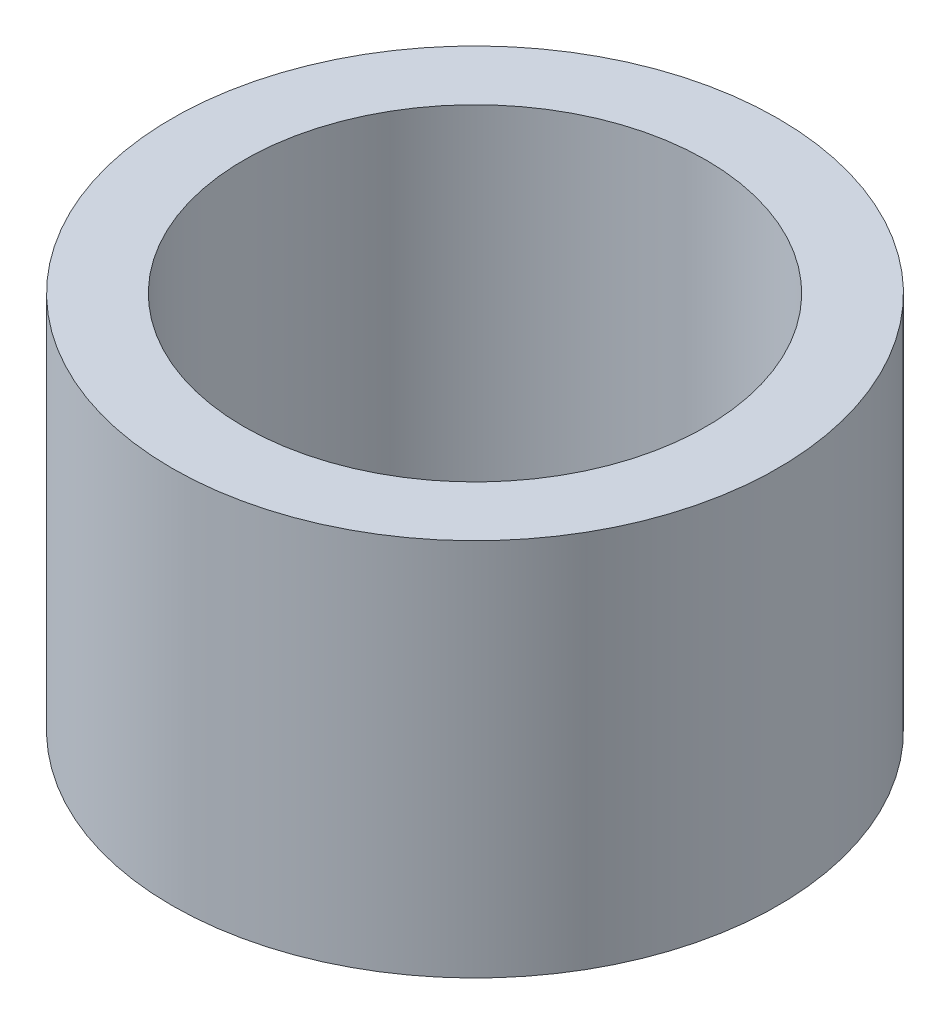
ISO-10303-21;
HEADER;
FILE_DESCRIPTION(('STEP AP214'),'2;1');
FILE_NAME('part.step','',(''),(''),'','','');
FILE_SCHEMA(('AUTOMOTIVE_DESIGN { 1 0 10303 214 1 1 1 1 }'));
ENDSEC;
DATA;
#1=APPLICATION_CONTEXT('core data for automotive mechanical design processes');
#2=APPLICATION_PROTOCOL_DEFINITION('international standard','automotive_design',2000,#1);
#3=PRODUCT_CONTEXT('',#1,'mechanical');
#4=PRODUCT('Part','Part','',(#3));
#5=PRODUCT_RELATED_PRODUCT_CATEGORY('part','',(#4));
#6=PRODUCT_DEFINITION_FORMATION('','',#4);
#7=PRODUCT_DEFINITION_CONTEXT('part definition',#1,'design');
#8=PRODUCT_DEFINITION('design','',#6,#7);
#9=PRODUCT_DEFINITION_SHAPE('','',#8);
#10=(LENGTH_UNIT() NAMED_UNIT(*) SI_UNIT(.MILLI.,.METRE.));
#11=(NAMED_UNIT(*) PLANE_ANGLE_UNIT() SI_UNIT($,.RADIAN.));
#12=(NAMED_UNIT(*) SI_UNIT($,.STERADIAN.) SOLID_ANGLE_UNIT());
#13=UNCERTAINTY_MEASURE_WITH_UNIT(LENGTH_MEASURE(1.E-05),#10,'distance_accuracy_value','');
#14=(GEOMETRIC_REPRESENTATION_CONTEXT(3) GLOBAL_UNCERTAINTY_ASSIGNED_CONTEXT((#13)) GLOBAL_UNIT_ASSIGNED_CONTEXT((#10,
#11,#12)) REPRESENTATION_CONTEXT('',''));
#15=CARTESIAN_POINT('',(0.,0.,0.));
#16=DIRECTION('',(0.,0.,1.));
#17=DIRECTION('',(1.,0.,0.));
#18=AXIS2_PLACEMENT_3D('',#15,#16,#17);
#19=CARTESIAN_POINT('',(0.,5.,0.));
#20=DIRECTION('',(0.,1.,0.));
#21=DIRECTION('',(0.,0.,1.));
#22=AXIS2_PLACEMENT_3D('',#19,#20,#21);
#23=PLANE('',#22);
#24=CARTESIAN_POINT('',(0.,5.,0.));
#25=DIRECTION('',(0.,1.,0.));
#26=DIRECTION('',(0.,0.,1.));
#27=AXIS2_PLACEMENT_3D('',#24,#25,#26);
#28=CIRCLE('',#27,4.);
#29=CARTESIAN_POINT('',(0.,5.,4.));
#30=VERTEX_POINT('',#29);
#31=EDGE_CURVE('E10',#30,#30,#28,.T.);
#32=ORIENTED_EDGE('',*,*,#31,.T.);
#33=EDGE_LOOP('',(#32));
#34=FACE_BOUND('',#33,.T.);
#35=CARTESIAN_POINT('',(0.,5.,0.));
#36=DIRECTION('',(0.,1.,0.));
#37=DIRECTION('',(0.,0.,1.));
#38=AXIS2_PLACEMENT_3D('',#35,#36,#37);
#39=CIRCLE('',#38,3.05);
#40=CARTESIAN_POINT('',(0.,5.,3.05));
#41=VERTEX_POINT('',#40);
#42=EDGE_CURVE('E42',#41,#41,#39,.T.);
#43=ORIENTED_EDGE('',*,*,#42,.F.);
#44=EDGE_LOOP('',(#43));
#45=FACE_BOUND('',#44,.T.);
#46=ADVANCED_FACE('F31',(#34,#45),#23,.T.);
#47=CARTESIAN_POINT('',(0.,0.,0.));
#48=DIRECTION('',(0.,1.,0.));
#49=DIRECTION('',(0.,0.,1.));
#50=AXIS2_PLACEMENT_3D('',#47,#48,#49);
#51=PLANE('',#50);
#52=CARTESIAN_POINT('',(0.,0.,0.));
#53=DIRECTION('',(0.,1.,0.));
#54=DIRECTION('',(0.,0.,1.));
#55=AXIS2_PLACEMENT_3D('',#52,#53,#54);
#56=CIRCLE('',#55,4.);
#57=CARTESIAN_POINT('',(0.,0.,4.));
#58=VERTEX_POINT('',#57);
#59=EDGE_CURVE('E35',#58,#58,#56,.T.);
#60=ORIENTED_EDGE('',*,*,#59,.F.);
#61=EDGE_LOOP('',(#60));
#62=FACE_BOUND('',#61,.T.);
#63=CARTESIAN_POINT('',(0.,0.,0.));
#64=DIRECTION('',(0.,1.,0.));
#65=DIRECTION('',(0.,0.,1.));
#66=AXIS2_PLACEMENT_3D('',#63,#64,#65);
#67=CIRCLE('',#66,3.05);
#68=CARTESIAN_POINT('',(0.,0.,3.05));
#69=VERTEX_POINT('',#68);
#70=EDGE_CURVE('E44',#69,#69,#67,.T.);
#71=ORIENTED_EDGE('',*,*,#70,.T.);
#72=EDGE_LOOP('',(#71));
#73=FACE_BOUND('',#72,.T.);
#74=ADVANCED_FACE('F54',(#62,#73),#51,.F.);
#75=CARTESIAN_POINT('',(0.,5.,0.));
#76=DIRECTION('',(0.,-1.,0.));
#77=DIRECTION('',(0.,0.,-1.));
#78=AXIS2_PLACEMENT_3D('',#75,#76,#77);
#79=CYLINDRICAL_SURFACE('',#78,4.);
#80=ORIENTED_EDGE('',*,*,#31,.F.);
#81=EDGE_LOOP('',(#80));
#82=FACE_BOUND('',#81,.T.);
#83=ORIENTED_EDGE('',*,*,#59,.T.);
#84=EDGE_LOOP('',(#83));
#85=FACE_BOUND('',#84,.T.);
#86=ADVANCED_FACE('F33',(#82,#85),#79,.T.);
#87=CARTESIAN_POINT('',(0.,5.,0.));
#88=DIRECTION('',(0.,-1.,0.));
#89=DIRECTION('',(0.,0.,-1.));
#90=AXIS2_PLACEMENT_3D('',#87,#88,#89);
#91=CYLINDRICAL_SURFACE('',#90,3.05);
#92=ORIENTED_EDGE('',*,*,#42,.T.);
#93=EDGE_LOOP('',(#92));
#94=FACE_BOUND('',#93,.T.);
#95=ORIENTED_EDGE('',*,*,#70,.F.);
#96=EDGE_LOOP('',(#95));
#97=FACE_BOUND('',#96,.T.);
#98=ADVANCED_FACE('F50',(#94,#97),#91,.F.);
#99=CLOSED_SHELL('',(#46,#74,#86,#98));
#100=MANIFOLD_SOLID_BREP('B2',#99);
#101=ADVANCED_BREP_SHAPE_REPRESENTATION('',(#18,#100),#14);
#102=SHAPE_DEFINITION_REPRESENTATION(#9,#101);
ENDSEC;
END-ISO-10303-21;
